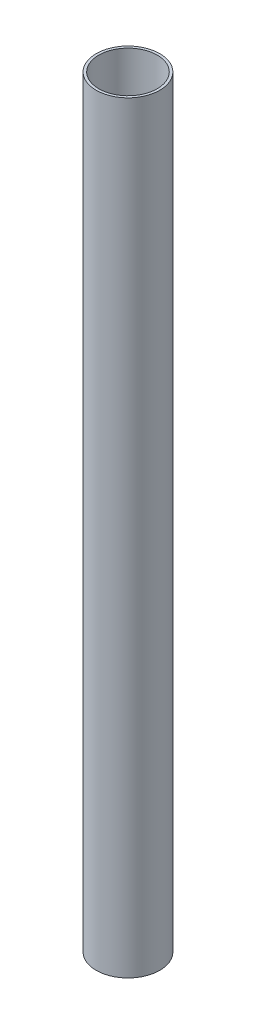
ISO-10303-21;
HEADER;
FILE_DESCRIPTION(('STEP AP214'),'2;1');
FILE_NAME('part.step','',(''),(''),'','','');
FILE_SCHEMA(('AUTOMOTIVE_DESIGN { 1 0 10303 214 1 1 1 1 }'));
ENDSEC;
DATA;
#1=APPLICATION_CONTEXT('core data for automotive mechanical design processes');
#2=APPLICATION_PROTOCOL_DEFINITION('international standard','automotive_design',2000,#1);
#3=PRODUCT_CONTEXT('',#1,'mechanical');
#4=PRODUCT('Part','Part','',(#3));
#5=PRODUCT_RELATED_PRODUCT_CATEGORY('part','',(#4));
#6=PRODUCT_DEFINITION_FORMATION('','',#4);
#7=PRODUCT_DEFINITION_CONTEXT('part definition',#1,'design');
#8=PRODUCT_DEFINITION('design','',#6,#7);
#9=PRODUCT_DEFINITION_SHAPE('','',#8);
#10=(LENGTH_UNIT() NAMED_UNIT(*) SI_UNIT(.MILLI.,.METRE.));
#11=(NAMED_UNIT(*) PLANE_ANGLE_UNIT() SI_UNIT($,.RADIAN.));
#12=(NAMED_UNIT(*) SI_UNIT($,.STERADIAN.) SOLID_ANGLE_UNIT());
#13=UNCERTAINTY_MEASURE_WITH_UNIT(LENGTH_MEASURE(1.E-05),#10,'distance_accuracy_value','');
#14=(GEOMETRIC_REPRESENTATION_CONTEXT(3) GLOBAL_UNCERTAINTY_ASSIGNED_CONTEXT((#13)) GLOBAL_UNIT_ASSIGNED_CONTEXT((#10,
#11,#12)) REPRESENTATION_CONTEXT('',''));
#15=CARTESIAN_POINT('',(0.,0.,0.));
#16=DIRECTION('',(0.,0.,1.));
#17=DIRECTION('',(1.,0.,0.));
#18=AXIS2_PLACEMENT_3D('',#15,#16,#17);
#19=CARTESIAN_POINT('',(0.,-914.4,0.));
#20=DIRECTION('',(0.,1.,0.));
#21=DIRECTION('',(0.,0.,1.));
#22=AXIS2_PLACEMENT_3D('',#19,#20,#21);
#23=CYLINDRICAL_SURFACE('',#22,38.1);
#24=CARTESIAN_POINT('',(0.,-914.4,0.));
#25=DIRECTION('',(0.,1.,0.));
#26=DIRECTION('',(0.,0.,1.));
#27=AXIS2_PLACEMENT_3D('',#24,#25,#26);
#28=CIRCLE('',#27,38.1);
#29=CARTESIAN_POINT('',(0.,-914.4,38.1));
#30=VERTEX_POINT('',#29);
#31=EDGE_CURVE('E10',#30,#30,#28,.T.);
#32=ORIENTED_EDGE('',*,*,#31,.T.);
#33=EDGE_LOOP('',(#32));
#34=FACE_BOUND('',#33,.T.);
#35=CARTESIAN_POINT('',(0.,0.,0.));
#36=DIRECTION('',(0.,1.,0.));
#37=DIRECTION('',(0.,0.,1.));
#38=AXIS2_PLACEMENT_3D('',#35,#36,#37);
#39=CIRCLE('',#38,38.1);
#40=CARTESIAN_POINT('',(0.,0.,38.1));
#41=VERTEX_POINT('',#40);
#42=EDGE_CURVE('E44',#41,#41,#39,.T.);
#43=ORIENTED_EDGE('',*,*,#42,.F.);
#44=EDGE_LOOP('',(#43));
#45=FACE_BOUND('',#44,.T.);
#46=ADVANCED_FACE('F41',(#34,#45),#23,.T.);
#47=CARTESIAN_POINT('',(0.,-914.4,0.));
#48=DIRECTION('',(0.,1.,0.));
#49=DIRECTION('',(0.,0.,1.));
#50=AXIS2_PLACEMENT_3D('',#47,#48,#49);
#51=PLANE('',#50);
#52=CARTESIAN_POINT('',(0.,-914.4,0.));
#53=DIRECTION('',(0.,1.,0.));
#54=DIRECTION('',(0.,0.,1.));
#55=AXIS2_PLACEMENT_3D('',#52,#53,#54);
#56=CIRCLE('',#55,35.052);
#57=CARTESIAN_POINT('',(0.,-914.4,35.052));
#58=VERTEX_POINT('',#57);
#59=EDGE_CURVE('E53',#58,#58,#56,.T.);
#60=ORIENTED_EDGE('',*,*,#59,.T.);
#61=EDGE_LOOP('',(#60));
#62=FACE_BOUND('',#61,.T.);
#63=ORIENTED_EDGE('',*,*,#31,.F.);
#64=EDGE_LOOP('',(#63));
#65=FACE_BOUND('',#64,.T.);
#66=ADVANCED_FACE('F63',(#62,#65),#51,.F.);
#67=CARTESIAN_POINT('',(0.,0.,0.));
#68=DIRECTION('',(0.,1.,0.));
#69=DIRECTION('',(0.,0.,1.));
#70=AXIS2_PLACEMENT_3D('',#67,#68,#69);
#71=PLANE('',#70);
#72=CARTESIAN_POINT('',(0.,0.,0.));
#73=DIRECTION('',(0.,1.,0.));
#74=DIRECTION('',(0.,0.,1.));
#75=AXIS2_PLACEMENT_3D('',#72,#73,#74);
#76=CIRCLE('',#75,35.052);
#77=CARTESIAN_POINT('',(0.,0.,35.052));
#78=VERTEX_POINT('',#77);
#79=EDGE_CURVE('E55',#78,#78,#76,.T.);
#80=ORIENTED_EDGE('',*,*,#79,.F.);
#81=EDGE_LOOP('',(#80));
#82=FACE_BOUND('',#81,.T.);
#83=ORIENTED_EDGE('',*,*,#42,.T.);
#84=EDGE_LOOP('',(#83));
#85=FACE_BOUND('',#84,.T.);
#86=ADVANCED_FACE('F69',(#82,#85),#71,.T.);
#87=CARTESIAN_POINT('',(0.,-914.4,0.));
#88=DIRECTION('',(0.,1.,0.));
#89=DIRECTION('',(0.,0.,1.));
#90=AXIS2_PLACEMENT_3D('',#87,#88,#89);
#91=CYLINDRICAL_SURFACE('',#90,35.052);
#92=ORIENTED_EDGE('',*,*,#59,.F.);
#93=EDGE_LOOP('',(#92));
#94=FACE_BOUND('',#93,.T.);
#95=ORIENTED_EDGE('',*,*,#79,.T.);
#96=EDGE_LOOP('',(#95));
#97=FACE_BOUND('',#96,.T.);
#98=ADVANCED_FACE('F66',(#94,#97),#91,.F.);
#99=CLOSED_SHELL('',(#46,#66,#86,#98));
#100=MANIFOLD_SOLID_BREP('B2',#99);
#101=ADVANCED_BREP_SHAPE_REPRESENTATION('',(#18,#100),#14);
#102=SHAPE_DEFINITION_REPRESENTATION(#9,#101);
ENDSEC;
END-ISO-10303-21;
